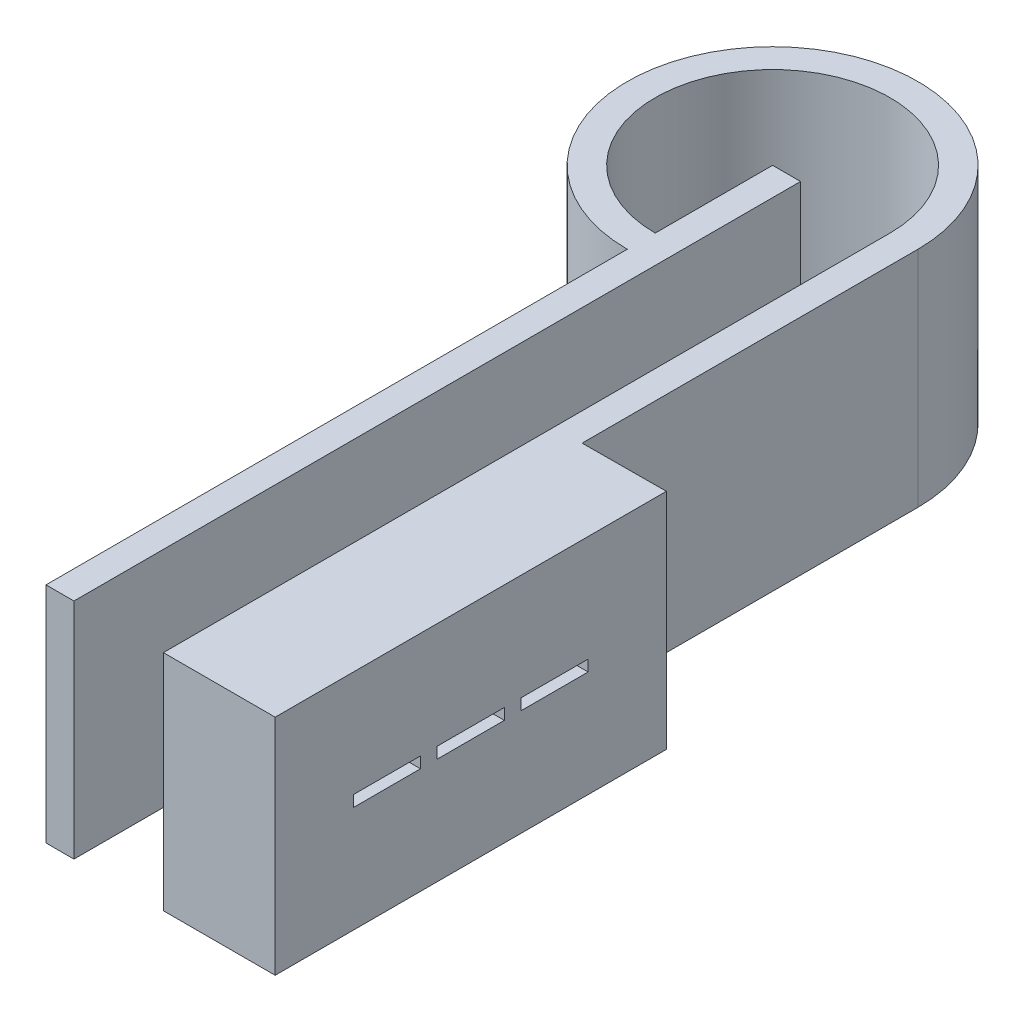
ISO-10303-21;
HEADER;
FILE_DESCRIPTION(('STEP AP214'),'2;1');
FILE_NAME('part.step','',(''),(''),'','','');
FILE_SCHEMA(('AUTOMOTIVE_DESIGN { 1 0 10303 214 1 1 1 1 }'));
ENDSEC;
DATA;
#1=APPLICATION_CONTEXT('core data for automotive mechanical design processes');
#2=APPLICATION_PROTOCOL_DEFINITION('international standard','automotive_design',2000,#1);
#3=PRODUCT_CONTEXT('',#1,'mechanical');
#4=PRODUCT('Part','Part','',(#3));
#5=PRODUCT_RELATED_PRODUCT_CATEGORY('part','',(#4));
#6=PRODUCT_DEFINITION_FORMATION('','',#4);
#7=PRODUCT_DEFINITION_CONTEXT('part definition',#1,'design');
#8=PRODUCT_DEFINITION('design','',#6,#7);
#9=PRODUCT_DEFINITION_SHAPE('','',#8);
#10=(LENGTH_UNIT() NAMED_UNIT(*) SI_UNIT(.MILLI.,.METRE.));
#11=(NAMED_UNIT(*) PLANE_ANGLE_UNIT() SI_UNIT($,.RADIAN.));
#12=(NAMED_UNIT(*) SI_UNIT($,.STERADIAN.) SOLID_ANGLE_UNIT());
#13=UNCERTAINTY_MEASURE_WITH_UNIT(LENGTH_MEASURE(1.E-05),#10,'distance_accuracy_value','');
#14=(GEOMETRIC_REPRESENTATION_CONTEXT(3) GLOBAL_UNCERTAINTY_ASSIGNED_CONTEXT((#13)) GLOBAL_UNIT_ASSIGNED_CONTEXT((#10,
#11,#12)) REPRESENTATION_CONTEXT('',''));
#15=CARTESIAN_POINT('',(0.,0.,0.));
#16=DIRECTION('',(0.,0.,1.));
#17=DIRECTION('',(1.,0.,0.));
#18=AXIS2_PLACEMENT_3D('',#15,#16,#17);
#19=CARTESIAN_POINT('',(-33.301242738674,20.,0.));
#20=DIRECTION('',(1.,0.,0.));
#21=DIRECTION('',(0.,0.,-1.));
#22=AXIS2_PLACEMENT_3D('',#19,#20,#21);
#23=PLANE('',#22);
#24=DIRECTION('',(0.,0.,1.));
#25=VECTOR('',#24,1.);
#26=CARTESIAN_POINT('',(-33.301242738674,0.,0.));
#27=LINE('',#26,#25);
#28=CARTESIAN_POINT('',(-33.301242738674,0.,-22.7488967204412));
#29=VERTEX_POINT('',#28);
#30=CARTESIAN_POINT('',(-33.301242738674,0.,42.2511032795588));
#31=VERTEX_POINT('',#30);
#32=EDGE_CURVE('E293',#29,#31,#27,.T.);
#33=ORIENTED_EDGE('',*,*,#32,.T.);
#34=DIRECTION('',(0.,-1.,0.));
#35=VECTOR('',#34,1.);
#36=CARTESIAN_POINT('',(-33.301242738674,0.,42.2511032795588));
#37=LINE('',#36,#35);
#38=CARTESIAN_POINT('',(-33.301242738674,20.,42.2511032795588));
#39=VERTEX_POINT('',#38);
#40=EDGE_CURVE('E286',#39,#31,#37,.T.);
#41=ORIENTED_EDGE('',*,*,#40,.F.);
#42=DIRECTION('',(0.,0.,1.));
#43=VECTOR('',#42,1.);
#44=CARTESIAN_POINT('',(-33.301242738674,20.,0.));
#45=LINE('',#44,#43);
#46=CARTESIAN_POINT('',(-33.301242738674,20.,-22.7488967204412));
#47=VERTEX_POINT('',#46);
#48=EDGE_CURVE('E268',#47,#39,#45,.T.);
#49=ORIENTED_EDGE('',*,*,#48,.F.);
#50=DIRECTION('',(0.,-1.,0.));
#51=VECTOR('',#50,1.);
#52=CARTESIAN_POINT('',(-33.301242738674,20.,-22.7488967204412));
#53=LINE('',#52,#51);
#54=EDGE_CURVE('E509',#47,#29,#53,.T.);
#55=ORIENTED_EDGE('',*,*,#54,.T.);
#56=EDGE_LOOP('',(#33,#41,#49,#55));
#57=FACE_BOUND('',#56,.T.);
#58=CARTESIAN_POINT('',(-33.301242738674,10.,32.2511032795588));
#59=DIRECTION('',(-1.,0.,0.));
#60=DIRECTION('',(0.,0.,1.));
#61=AXIS2_PLACEMENT_3D('',#58,#59,#60);
#62=CIRCLE('',#61,4.);
#63=CARTESIAN_POINT('',(-33.301242738674,10.,36.2511032795588));
#64=VERTEX_POINT('',#63);
#65=EDGE_CURVE('E449',#64,#64,#62,.T.);
#66=ORIENTED_EDGE('',*,*,#65,.F.);
#67=EDGE_LOOP('',(#66));
#68=FACE_BOUND('',#67,.T.);
#69=CARTESIAN_POINT('',(-33.301242738674,10.,17.2511032795588));
#70=DIRECTION('',(-1.,0.,0.));
#71=DIRECTION('',(0.,0.,1.));
#72=AXIS2_PLACEMENT_3D('',#69,#70,#71);
#73=CIRCLE('',#72,4.);
#74=CARTESIAN_POINT('',(-33.301242738674,10.,21.2511032795588));
#75=VERTEX_POINT('',#74);
#76=EDGE_CURVE('E445',#75,#75,#73,.T.);
#77=ORIENTED_EDGE('',*,*,#76,.F.);
#78=EDGE_LOOP('',(#77));
#79=FACE_BOUND('',#78,.T.);
#80=DIRECTION('',(0.,0.,1.));
#81=VECTOR('',#80,1.);
#82=CARTESIAN_POINT('',(-33.301242738674,10.5,0.));
#83=LINE('',#82,#81);
#84=CARTESIAN_POINT('',(-33.301242738674,10.5,21.7511032795588));
#85=VERTEX_POINT('',#84);
#86=CARTESIAN_POINT('',(-33.301242738674,10.5,22.1996331151242));
#87=VERTEX_POINT('',#86);
#88=EDGE_CURVE('E398',#85,#87,#83,.T.);
#89=ORIENTED_EDGE('',*,*,#88,.T.);
#90=CARTESIAN_POINT('',(-33.301242738674,10.,24.7511032795588));
#91=DIRECTION('',(-1.,0.,0.));
#92=DIRECTION('',(0.,0.,1.));
#93=AXIS2_PLACEMENT_3D('',#90,#91,#92);
#94=CIRCLE('',#93,2.59999999999999);
#95=CARTESIAN_POINT('',(-33.301242738674,10.5,27.3025734439934));
#96=VERTEX_POINT('',#95);
#97=EDGE_CURVE('E322',#96,#87,#94,.T.);
#98=ORIENTED_EDGE('',*,*,#97,.F.);
#99=CARTESIAN_POINT('',(-33.301242738674,10.5,27.7511032795588));
#100=VERTEX_POINT('',#99);
#101=EDGE_CURVE('E396',#96,#100,#83,.T.);
#102=ORIENTED_EDGE('',*,*,#101,.T.);
#103=DIRECTION('',(0.,-1.,0.));
#104=VECTOR('',#103,1.);
#105=CARTESIAN_POINT('',(-33.301242738674,0.,27.7511032795588));
#106=LINE('',#105,#104);
#107=CARTESIAN_POINT('',(-33.301242738674,9.5,27.7511032795588));
#108=VERTEX_POINT('',#107);
#109=EDGE_CURVE('E402',#100,#108,#106,.T.);
#110=ORIENTED_EDGE('',*,*,#109,.T.);
#111=DIRECTION('',(0.,0.,1.));
#112=VECTOR('',#111,1.);
#113=CARTESIAN_POINT('',(-33.301242738674,9.5,0.));
#114=LINE('',#113,#112);
#115=CARTESIAN_POINT('',(-33.301242738674,9.5,27.3025734439934));
#116=VERTEX_POINT('',#115);
#117=EDGE_CURVE('E406',#116,#108,#114,.T.);
#118=ORIENTED_EDGE('',*,*,#117,.F.);
#119=CARTESIAN_POINT('',(-33.301242738674,9.5,22.1996331151242));
#120=VERTEX_POINT('',#119);
#121=EDGE_CURVE('E318',#120,#116,#94,.T.);
#122=ORIENTED_EDGE('',*,*,#121,.F.);
#123=CARTESIAN_POINT('',(-33.301242738674,9.5,21.7511032795588));
#124=VERTEX_POINT('',#123);
#125=EDGE_CURVE('E407',#124,#120,#114,.T.);
#126=ORIENTED_EDGE('',*,*,#125,.F.);
#127=DIRECTION('',(0.,-1.,0.));
#128=VECTOR('',#127,1.);
#129=CARTESIAN_POINT('',(-33.301242738674,0.,21.7511032795588));
#130=LINE('',#129,#128);
#131=EDGE_CURVE('E393',#85,#124,#130,.T.);
#132=ORIENTED_EDGE('',*,*,#131,.F.);
#133=EDGE_LOOP('',(#89,#98,#102,#110,#118,#122,#126,#132));
#134=FACE_BOUND('',#133,.T.);
#135=ADVANCED_FACE('F81',(#57,#68,#79,#134),#23,.F.);
#136=CARTESIAN_POINT('',(-23.301242738674,20.,0.));
#137=DIRECTION('',(1.,0.,0.));
#138=DIRECTION('',(0.,0.,-1.));
#139=AXIS2_PLACEMENT_3D('',#136,#137,#138);
#140=PLANE('',#139);
#141=DIRECTION('',(0.,0.,1.));
#142=VECTOR('',#141,1.);
#143=CARTESIAN_POINT('',(-23.301242738674,0.,0.));
#144=LINE('',#143,#142);
#145=CARTESIAN_POINT('',(-23.301242738674,0.,7.25110327955879));
#146=VERTEX_POINT('',#145);
#147=CARTESIAN_POINT('',(-23.301242738674,0.,42.2511032795588));
#148=VERTEX_POINT('',#147);
#149=EDGE_CURVE('E481',#146,#148,#144,.T.);
#150=ORIENTED_EDGE('',*,*,#149,.F.);
#151=DIRECTION('',(0.,-1.,0.));
#152=VECTOR('',#151,1.);
#153=CARTESIAN_POINT('',(-23.301242738674,20.,7.25110327955879));
#154=LINE('',#153,#152);
#155=CARTESIAN_POINT('',(-23.301242738674,20.,7.25110327955879));
#156=VERTEX_POINT('',#155);
#157=EDGE_CURVE('E506',#156,#146,#154,.T.);
#158=ORIENTED_EDGE('',*,*,#157,.F.);
#159=DIRECTION('',(0.,0.,1.));
#160=VECTOR('',#159,1.);
#161=CARTESIAN_POINT('',(-23.301242738674,20.,0.));
#162=LINE('',#161,#160);
#163=CARTESIAN_POINT('',(-23.301242738674,20.,42.2511032795588));
#164=VERTEX_POINT('',#163);
#165=EDGE_CURVE('E279',#156,#164,#162,.T.);
#166=ORIENTED_EDGE('',*,*,#165,.T.);
#167=DIRECTION('',(0.,1.,0.));
#168=VECTOR('',#167,1.);
#169=CARTESIAN_POINT('',(-23.301242738674,0.,42.2511032795588));
#170=LINE('',#169,#168);
#171=EDGE_CURVE('E288',#148,#164,#170,.T.);
#172=ORIENTED_EDGE('',*,*,#171,.F.);
#173=EDGE_LOOP('',(#150,#158,#166,#172));
#174=FACE_BOUND('',#173,.T.);
#175=DIRECTION('',(0.,0.,1.));
#176=VECTOR('',#175,1.);
#177=CARTESIAN_POINT('',(-23.301242738674,10.5,0.));
#178=LINE('',#177,#176);
#179=CARTESIAN_POINT('',(-23.301242738674,10.5,21.7511032795588));
#180=VERTEX_POINT('',#179);
#181=CARTESIAN_POINT('',(-23.301242738674,10.5,27.7511032795588));
#182=VERTEX_POINT('',#181);
#183=EDGE_CURVE('E415',#180,#182,#178,.T.);
#184=ORIENTED_EDGE('',*,*,#183,.F.);
#185=DIRECTION('',(0.,-1.,0.));
#186=VECTOR('',#185,1.);
#187=CARTESIAN_POINT('',(-23.301242738674,0.,21.7511032795588));
#188=LINE('',#187,#186);
#189=CARTESIAN_POINT('',(-23.301242738674,9.5,21.7511032795588));
#190=VERTEX_POINT('',#189);
#191=EDGE_CURVE('E356',#180,#190,#188,.T.);
#192=ORIENTED_EDGE('',*,*,#191,.T.);
#193=DIRECTION('',(0.,0.,1.));
#194=VECTOR('',#193,1.);
#195=CARTESIAN_POINT('',(-23.301242738674,9.5,0.));
#196=LINE('',#195,#194);
#197=CARTESIAN_POINT('',(-23.301242738674,9.5,27.7511032795588));
#198=VERTEX_POINT('',#197);
#199=EDGE_CURVE('E397',#190,#198,#196,.T.);
#200=ORIENTED_EDGE('',*,*,#199,.T.);
#201=DIRECTION('',(0.,-1.,0.));
#202=VECTOR('',#201,1.);
#203=CARTESIAN_POINT('',(-23.301242738674,0.,27.7511032795588));
#204=LINE('',#203,#202);
#205=EDGE_CURVE('E419',#182,#198,#204,.T.);
#206=ORIENTED_EDGE('',*,*,#205,.F.);
#207=EDGE_LOOP('',(#184,#192,#200,#206));
#208=FACE_BOUND('',#207,.T.);
#209=DIRECTION('',(0.,-1.,0.));
#210=VECTOR('',#209,1.);
#211=CARTESIAN_POINT('',(-23.301242738674,0.,14.2511032795588));
#212=LINE('',#211,#210);
#213=CARTESIAN_POINT('',(-23.301242738674,10.5,14.2511032795588));
#214=VERTEX_POINT('',#213);
#215=CARTESIAN_POINT('',(-23.301242738674,9.49999999999999,14.2511032795588));
#216=VERTEX_POINT('',#215);
#217=EDGE_CURVE('E339',#214,#216,#212,.T.);
#218=ORIENTED_EDGE('',*,*,#217,.T.);
#219=DIRECTION('',(0.,0.,1.));
#220=VECTOR('',#219,1.);
#221=CARTESIAN_POINT('',(-23.301242738674,9.5,0.));
#222=LINE('',#221,#220);
#223=CARTESIAN_POINT('',(-23.301242738674,9.5,20.2511032795588));
#224=VERTEX_POINT('',#223);
#225=EDGE_CURVE('E335',#216,#224,#222,.T.);
#226=ORIENTED_EDGE('',*,*,#225,.T.);
#227=DIRECTION('',(0.,-1.,0.));
#228=VECTOR('',#227,1.);
#229=CARTESIAN_POINT('',(-23.301242738674,0.,20.2511032795588));
#230=LINE('',#229,#228);
#231=CARTESIAN_POINT('',(-23.301242738674,10.5,20.2511032795588));
#232=VERTEX_POINT('',#231);
#233=EDGE_CURVE('E348',#232,#224,#230,.T.);
#234=ORIENTED_EDGE('',*,*,#233,.F.);
#235=DIRECTION('',(0.,0.,1.));
#236=VECTOR('',#235,1.);
#237=CARTESIAN_POINT('',(-23.301242738674,10.5,0.));
#238=LINE('',#237,#236);
#239=EDGE_CURVE('E344',#214,#232,#238,.T.);
#240=ORIENTED_EDGE('',*,*,#239,.F.);
#241=EDGE_LOOP('',(#218,#226,#234,#240));
#242=FACE_BOUND('',#241,.T.);
#243=DIRECTION('',(0.,0.,1.));
#244=VECTOR('',#243,1.);
#245=CARTESIAN_POINT('',(-23.301242738674,10.5,0.));
#246=LINE('',#245,#244);
#247=CARTESIAN_POINT('',(-23.301242738674,10.5,29.2511032795588));
#248=VERTEX_POINT('',#247);
#249=CARTESIAN_POINT('',(-23.301242738674,10.5,35.2511032795588));
#250=VERTEX_POINT('',#249);
#251=EDGE_CURVE('E369',#248,#250,#246,.T.);
#252=ORIENTED_EDGE('',*,*,#251,.F.);
#253=DIRECTION('',(0.,-1.,0.));
#254=VECTOR('',#253,1.);
#255=CARTESIAN_POINT('',(-23.301242738674,0.,29.2511032795588));
#256=LINE('',#255,#254);
#257=CARTESIAN_POINT('',(-23.301242738674,9.5,29.2511032795588));
#258=VERTEX_POINT('',#257);
#259=EDGE_CURVE('E334',#248,#258,#256,.T.);
#260=ORIENTED_EDGE('',*,*,#259,.T.);
#261=DIRECTION('',(0.,0.,1.));
#262=VECTOR('',#261,1.);
#263=CARTESIAN_POINT('',(-23.301242738674,9.50000000000001,0.));
#264=LINE('',#263,#262);
#265=CARTESIAN_POINT('',(-23.301242738674,9.5,35.2511032795588));
#266=VERTEX_POINT('',#265);
#267=EDGE_CURVE('E377',#258,#266,#264,.T.);
#268=ORIENTED_EDGE('',*,*,#267,.T.);
#269=DIRECTION('',(0.,-1.,0.));
#270=VECTOR('',#269,1.);
#271=CARTESIAN_POINT('',(-23.301242738674,0.,35.2511032795588));
#272=LINE('',#271,#270);
#273=EDGE_CURVE('E373',#250,#266,#272,.T.);
#274=ORIENTED_EDGE('',*,*,#273,.F.);
#275=EDGE_LOOP('',(#252,#260,#268,#274));
#276=FACE_BOUND('',#275,.T.);
#277=ADVANCED_FACE('F590',(#174,#208,#242,#276),#140,.T.);
#278=CARTESIAN_POINT('',(-25.301242738674,10.,32.2511032795588));
#279=DIRECTION('',(-1.,0.,0.));
#280=DIRECTION('',(0.,0.,1.));
#281=AXIS2_PLACEMENT_3D('',#278,#279,#280);
#282=PLANE('',#281);
#283=CARTESIAN_POINT('',(-25.301242738674,10.,32.2511032795588));
#284=DIRECTION('',(-1.,0.,0.));
#285=DIRECTION('',(0.,0.,1.));
#286=AXIS2_PLACEMENT_3D('',#283,#284,#285);
#287=CIRCLE('',#286,4.);
#288=CARTESIAN_POINT('',(-25.301242738674,10.,36.2511032795588));
#289=VERTEX_POINT('',#288);
#290=EDGE_CURVE('E430',#289,#289,#287,.T.);
#291=ORIENTED_EDGE('',*,*,#290,.T.);
#292=EDGE_LOOP('',(#291));
#293=FACE_BOUND('',#292,.T.);
#294=DIRECTION('',(0.,0.,-1.));
#295=VECTOR('',#294,1.);
#296=CARTESIAN_POINT('',(-25.301242738674,9.5,32.2511032795588));
#297=LINE('',#296,#295);
#298=CARTESIAN_POINT('',(-25.301242738674,9.5,35.2511032795588));
#299=VERTEX_POINT('',#298);
#300=CARTESIAN_POINT('',(-25.301242738674,9.5,29.2511032795588));
#301=VERTEX_POINT('',#300);
#302=EDGE_CURVE('E561',#299,#301,#297,.T.);
#303=ORIENTED_EDGE('',*,*,#302,.T.);
#304=DIRECTION('',(0.,1.,0.));
#305=VECTOR('',#304,1.);
#306=CARTESIAN_POINT('',(-25.301242738674,10.,29.2511032795588));
#307=LINE('',#306,#305);
#308=CARTESIAN_POINT('',(-25.301242738674,10.5,29.2511032795588));
#309=VERTEX_POINT('',#308);
#310=EDGE_CURVE('E565',#301,#309,#307,.T.);
#311=ORIENTED_EDGE('',*,*,#310,.T.);
#312=DIRECTION('',(0.,0.,-1.));
#313=VECTOR('',#312,1.);
#314=CARTESIAN_POINT('',(-25.301242738674,10.5,32.2511032795588));
#315=LINE('',#314,#313);
#316=CARTESIAN_POINT('',(-25.301242738674,10.5,35.2511032795588));
#317=VERTEX_POINT('',#316);
#318=EDGE_CURVE('E554',#317,#309,#315,.T.);
#319=ORIENTED_EDGE('',*,*,#318,.F.);
#320=DIRECTION('',(0.,1.,0.));
#321=VECTOR('',#320,1.);
#322=CARTESIAN_POINT('',(-25.301242738674,10.,35.2511032795588));
#323=LINE('',#322,#321);
#324=EDGE_CURVE('E557',#299,#317,#323,.T.);
#325=ORIENTED_EDGE('',*,*,#324,.F.);
#326=EDGE_LOOP('',(#303,#311,#319,#325));
#327=FACE_BOUND('',#326,.T.);
#328=ADVANCED_FACE('F625',(#293,#327),#282,.T.);
#329=CARTESIAN_POINT('',(-25.301242738674,0.,0.));
#330=DIRECTION('',(-1.,0.,0.));
#331=DIRECTION('',(0.,0.,1.));
#332=AXIS2_PLACEMENT_3D('',#329,#330,#331);
#333=PLANE('',#332);
#334=CARTESIAN_POINT('',(-25.301242738674,10.,17.2511032795588));
#335=DIRECTION('',(-1.,0.,0.));
#336=DIRECTION('',(0.,0.,1.));
#337=AXIS2_PLACEMENT_3D('',#334,#335,#336);
#338=CIRCLE('',#337,4.);
#339=CARTESIAN_POINT('',(-25.301242738674,10.,21.2511032795588));
#340=VERTEX_POINT('',#339);
#341=EDGE_CURVE('E440',#340,#340,#338,.T.);
#342=ORIENTED_EDGE('',*,*,#341,.T.);
#343=EDGE_LOOP('',(#342));
#344=FACE_BOUND('',#343,.T.);
#345=DIRECTION('',(0.,1.,0.));
#346=VECTOR('',#345,1.);
#347=CARTESIAN_POINT('',(-25.301242738674,0.,20.2511032795588));
#348=LINE('',#347,#346);
#349=CARTESIAN_POINT('',(-25.301242738674,9.5,20.2511032795588));
#350=VERTEX_POINT('',#349);
#351=CARTESIAN_POINT('',(-25.301242738674,10.5,20.2511032795588));
#352=VERTEX_POINT('',#351);
#353=EDGE_CURVE('E547',#350,#352,#348,.T.);
#354=ORIENTED_EDGE('',*,*,#353,.F.);
#355=DIRECTION('',(0.,0.,-1.));
#356=VECTOR('',#355,1.);
#357=CARTESIAN_POINT('',(-25.301242738674,9.5,0.));
#358=LINE('',#357,#356);
#359=CARTESIAN_POINT('',(-25.301242738674,9.49999999999999,14.2511032795588));
#360=VERTEX_POINT('',#359);
#361=EDGE_CURVE('E550',#350,#360,#358,.T.);
#362=ORIENTED_EDGE('',*,*,#361,.T.);
#363=DIRECTION('',(0.,1.,0.));
#364=VECTOR('',#363,1.);
#365=CARTESIAN_POINT('',(-25.301242738674,0.,14.2511032795588));
#366=LINE('',#365,#364);
#367=CARTESIAN_POINT('',(-25.301242738674,10.5,14.2511032795588));
#368=VERTEX_POINT('',#367);
#369=EDGE_CURVE('E512',#360,#368,#366,.T.);
#370=ORIENTED_EDGE('',*,*,#369,.T.);
#371=DIRECTION('',(0.,0.,-1.));
#372=VECTOR('',#371,1.);
#373=CARTESIAN_POINT('',(-25.301242738674,10.5,0.));
#374=LINE('',#373,#372);
#375=EDGE_CURVE('E543',#352,#368,#374,.T.);
#376=ORIENTED_EDGE('',*,*,#375,.F.);
#377=EDGE_LOOP('',(#354,#362,#370,#376));
#378=FACE_BOUND('',#377,.T.);
#379=ADVANCED_FACE('F667',(#344,#378),#333,.T.);
#380=CARTESIAN_POINT('',(0.0399028769199251,20.,7.1202971000437));
#381=DIRECTION('',(-0.00560401480160105,0.,-0.999984297385766));
#382=DIRECTION('',(-0.999984297385766,0.,0.00560401480160105));
#383=AXIS2_PLACEMENT_3D('',#380,#381,#382);
#384=PLANE('',#383);
#385=DIRECTION('',(0.999984297385766,0.,-0.00560401480160105));
#386=VECTOR('',#385,1.);
#387=CARTESIAN_POINT('',(0.0399028769199251,0.,7.1202971000437));
#388=LINE('',#387,#386);
#389=CARTESIAN_POINT('',(-30.801242738674,0.,7.29313405056379));
#390=VERTEX_POINT('',#389);
#391=EDGE_CURVE('E484',#390,#146,#388,.T.);
#392=ORIENTED_EDGE('',*,*,#391,.F.);
#393=DIRECTION('',(0.,-1.,0.));
#394=VECTOR('',#393,1.);
#395=CARTESIAN_POINT('',(-30.801242738674,20.,7.29313405056379));
#396=LINE('',#395,#394);
#397=CARTESIAN_POINT('',(-30.801242738674,20.,7.29313405056379));
#398=VERTEX_POINT('',#397);
#399=EDGE_CURVE('E503',#398,#390,#396,.T.);
#400=ORIENTED_EDGE('',*,*,#399,.F.);
#401=DIRECTION('',(0.999984297385766,0.,-0.00560401480160105));
#402=VECTOR('',#401,1.);
#403=CARTESIAN_POINT('',(0.0399028769199251,20.,7.1202971000437));
#404=LINE('',#403,#402);
#405=EDGE_CURVE('E461',#398,#156,#404,.T.);
#406=ORIENTED_EDGE('',*,*,#405,.T.);
#407=ORIENTED_EDGE('',*,*,#157,.T.);
#408=EDGE_LOOP('',(#392,#400,#406,#407));
#409=FACE_BOUND('',#408,.T.);
#410=ADVANCED_FACE('F679',(#409),#384,.T.);
#411=CARTESIAN_POINT('',(-30.801242738674,20.,0.));
#412=DIRECTION('',(1.,0.,0.));
#413=DIRECTION('',(0.,0.,-1.));
#414=AXIS2_PLACEMENT_3D('',#411,#412,#413);
#415=PLANE('',#414);
#416=DIRECTION('',(0.,0.,1.));
#417=VECTOR('',#416,1.);
#418=CARTESIAN_POINT('',(-30.801242738674,0.,0.));
#419=LINE('',#418,#417);
#420=CARTESIAN_POINT('',(-30.801242738674,0.,-22.7488967204412));
#421=VERTEX_POINT('',#420);
#422=EDGE_CURVE('E488',#421,#390,#419,.T.);
#423=ORIENTED_EDGE('',*,*,#422,.F.);
#424=DIRECTION('',(0.,-1.,0.));
#425=VECTOR('',#424,1.);
#426=CARTESIAN_POINT('',(-30.801242738674,20.,-22.7488967204412));
#427=LINE('',#426,#425);
#428=CARTESIAN_POINT('',(-30.801242738674,20.,-22.7488967204412));
#429=VERTEX_POINT('',#428);
#430=EDGE_CURVE('E500',#429,#421,#427,.T.);
#431=ORIENTED_EDGE('',*,*,#430,.F.);
#432=DIRECTION('',(0.,0.,1.));
#433=VECTOR('',#432,1.);
#434=CARTESIAN_POINT('',(-30.801242738674,20.,0.));
#435=LINE('',#434,#433);
#436=EDGE_CURVE('E465',#429,#398,#435,.T.);
#437=ORIENTED_EDGE('',*,*,#436,.T.);
#438=ORIENTED_EDGE('',*,*,#399,.T.);
#439=EDGE_LOOP('',(#423,#431,#437,#438));
#440=FACE_BOUND('',#439,.T.);
#441=ADVANCED_FACE('F676',(#440),#415,.T.);
#442=CARTESIAN_POINT('',(-43.801242738674,20.,-22.7488967204412));
#443=DIRECTION('',(0.,-1.,0.));
#444=DIRECTION('',(0.,0.,-1.));
#445=AXIS2_PLACEMENT_3D('',#442,#443,#444);
#446=CYLINDRICAL_SURFACE('',#445,13.);
#447=CARTESIAN_POINT('',(-43.801242738674,0.,-22.7488967204412));
#448=DIRECTION('',(0.,1.,0.));
#449=DIRECTION('',(0.,0.,1.));
#450=AXIS2_PLACEMENT_3D('',#447,#448,#449);
#451=CIRCLE('',#450,13.);
#452=CARTESIAN_POINT('',(-43.801242738674,0.,-9.74889672044119));
#453=VERTEX_POINT('',#452);
#454=EDGE_CURVE('E457',#421,#453,#451,.T.);
#455=ORIENTED_EDGE('',*,*,#454,.T.);
#456=DIRECTION('',(0.,-1.,0.));
#457=VECTOR('',#456,1.);
#458=CARTESIAN_POINT('',(-43.801242738674,20.,-9.74889672044119));
#459=LINE('',#458,#457);
#460=CARTESIAN_POINT('',(-43.801242738674,20.,-9.74889672044119));
#461=VERTEX_POINT('',#460);
#462=EDGE_CURVE('E497',#461,#453,#459,.T.);
#463=ORIENTED_EDGE('',*,*,#462,.F.);
#464=CARTESIAN_POINT('',(-43.801242738674,20.,-22.7488967204412));
#465=DIRECTION('',(0.,1.,0.));
#466=DIRECTION('',(0.,0.,1.));
#467=AXIS2_PLACEMENT_3D('',#464,#465,#466);
#468=CIRCLE('',#467,13.);
#469=EDGE_CURVE('E469',#429,#461,#468,.T.);
#470=ORIENTED_EDGE('',*,*,#469,.F.);
#471=ORIENTED_EDGE('',*,*,#430,.T.);
#472=EDGE_LOOP('',(#455,#463,#470,#471));
#473=FACE_BOUND('',#472,.T.);
#474=ADVANCED_FACE('F634',(#473),#446,.T.);
#475=CARTESIAN_POINT('',(-43.801242738674,20.,-22.7488967204412));
#476=DIRECTION('',(0.,-1.,0.));
#477=DIRECTION('',(0.,0.,-1.));
#478=AXIS2_PLACEMENT_3D('',#475,#476,#477);
#479=CYLINDRICAL_SURFACE('',#478,10.5);
#480=CARTESIAN_POINT('',(-43.801242738674,0.,-22.7488967204412));
#481=DIRECTION('',(0.,1.,0.));
#482=DIRECTION('',(0.,0.,1.));
#483=AXIS2_PLACEMENT_3D('',#480,#481,#482);
#484=CIRCLE('',#483,10.5);
#485=CARTESIAN_POINT('',(-43.801242738674,0.,-12.2488967204412));
#486=VERTEX_POINT('',#485);
#487=EDGE_CURVE('E474',#29,#486,#484,.T.);
#488=ORIENTED_EDGE('',*,*,#487,.F.);
#489=ORIENTED_EDGE('',*,*,#54,.F.);
#490=CARTESIAN_POINT('',(-43.801242738674,20.,-22.7488967204412));
#491=DIRECTION('',(0.,1.,0.));
#492=DIRECTION('',(0.,0.,1.));
#493=AXIS2_PLACEMENT_3D('',#490,#491,#492);
#494=CIRCLE('',#493,10.5);
#495=CARTESIAN_POINT('',(-43.801242738674,20.,-12.2488967204412));
#496=VERTEX_POINT('',#495);
#497=EDGE_CURVE('E275',#47,#496,#494,.T.);
#498=ORIENTED_EDGE('',*,*,#497,.T.);
#499=DIRECTION('',(0.,-1.,0.));
#500=VECTOR('',#499,1.);
#501=CARTESIAN_POINT('',(-43.801242738674,20.,-12.2488967204412));
#502=LINE('',#501,#500);
#503=EDGE_CURVE('E473',#496,#486,#502,.T.);
#504=ORIENTED_EDGE('',*,*,#503,.T.);
#505=EDGE_LOOP('',(#488,#489,#498,#504));
#506=FACE_BOUND('',#505,.T.);
#507=ADVANCED_FACE('F630',(#506),#479,.F.);
#508=CARTESIAN_POINT('',(0.,0.,0.));
#509=DIRECTION('',(0.,1.,0.));
#510=DIRECTION('',(0.,0.,1.));
#511=AXIS2_PLACEMENT_3D('',#508,#509,#510);
#512=PLANE('',#511);
#513=ORIENTED_EDGE('',*,*,#487,.T.);
#514=DIRECTION('',(0.,0.,1.));
#515=VECTOR('',#514,1.);
#516=CARTESIAN_POINT('',(-43.801242738674,0.,-22.7488967204412));
#517=LINE('',#516,#515);
#518=CARTESIAN_POINT('',(-43.801242738674,0.,-22.7488967204412));
#519=VERTEX_POINT('',#518);
#520=EDGE_CURVE('E518',#519,#486,#517,.T.);
#521=ORIENTED_EDGE('',*,*,#520,.F.);
#522=DIRECTION('',(1.,0.,0.));
#523=VECTOR('',#522,1.);
#524=CARTESIAN_POINT('',(-43.801242738674,0.,-22.7488967204412));
#525=LINE('',#524,#523);
#526=CARTESIAN_POINT('',(-41.301242738674,0.,-22.7488967204412));
#527=VERTEX_POINT('',#526);
#528=EDGE_CURVE('E444',#519,#527,#525,.T.);
#529=ORIENTED_EDGE('',*,*,#528,.T.);
#530=DIRECTION('',(0.,0.,1.));
#531=VECTOR('',#530,1.);
#532=CARTESIAN_POINT('',(-41.301242738674,0.,-22.7488967204412));
#533=LINE('',#532,#531);
#534=CARTESIAN_POINT('',(-41.301242738674,0.,42.2511032795588));
#535=VERTEX_POINT('',#534);
#536=EDGE_CURVE('E529',#527,#535,#533,.T.);
#537=ORIENTED_EDGE('',*,*,#536,.T.);
#538=DIRECTION('',(1.,0.,0.));
#539=VECTOR('',#538,1.);
#540=CARTESIAN_POINT('',(-43.801242738674,0.,42.2511032795588));
#541=LINE('',#540,#539);
#542=CARTESIAN_POINT('',(-43.801242738674,0.,42.2511032795588));
#543=VERTEX_POINT('',#542);
#544=EDGE_CURVE('E302',#543,#535,#541,.T.);
#545=ORIENTED_EDGE('',*,*,#544,.F.);
#546=EDGE_CURVE('E532',#453,#543,#517,.T.);
#547=ORIENTED_EDGE('',*,*,#546,.F.);
#548=ORIENTED_EDGE('',*,*,#454,.F.);
#549=ORIENTED_EDGE('',*,*,#422,.T.);
#550=ORIENTED_EDGE('',*,*,#391,.T.);
#551=ORIENTED_EDGE('',*,*,#149,.T.);
#552=DIRECTION('',(1.,0.,0.));
#553=VECTOR('',#552,1.);
#554=CARTESIAN_POINT('',(-33.301242738674,0.,42.2511032795588));
#555=LINE('',#554,#553);
#556=EDGE_CURVE('E297',#31,#148,#555,.T.);
#557=ORIENTED_EDGE('',*,*,#556,.F.);
#558=ORIENTED_EDGE('',*,*,#32,.F.);
#559=EDGE_LOOP('',(#513,#521,#529,#537,#545,#547,#548,#549,#550,#551,#557,#558));
#560=FACE_BOUND('',#559,.T.);
#561=ADVANCED_FACE('F633',(#560),#512,.F.);
#562=CARTESIAN_POINT('',(0.,20.,0.));
#563=DIRECTION('',(0.,1.,0.));
#564=DIRECTION('',(0.,0.,1.));
#565=AXIS2_PLACEMENT_3D('',#562,#563,#564);
#566=PLANE('',#565);
#567=ORIENTED_EDGE('',*,*,#497,.F.);
#568=ORIENTED_EDGE('',*,*,#48,.T.);
#569=DIRECTION('',(-1.,0.,0.));
#570=VECTOR('',#569,1.);
#571=CARTESIAN_POINT('',(-33.301242738674,20.,42.2511032795588));
#572=LINE('',#571,#570);
#573=EDGE_CURVE('E272',#164,#39,#572,.T.);
#574=ORIENTED_EDGE('',*,*,#573,.F.);
#575=ORIENTED_EDGE('',*,*,#165,.F.);
#576=ORIENTED_EDGE('',*,*,#405,.F.);
#577=ORIENTED_EDGE('',*,*,#436,.F.);
#578=ORIENTED_EDGE('',*,*,#469,.T.);
#579=DIRECTION('',(0.,0.,1.));
#580=VECTOR('',#579,1.);
#581=CARTESIAN_POINT('',(-43.801242738674,20.,-22.7488967204412));
#582=LINE('',#581,#580);
#583=CARTESIAN_POINT('',(-43.801242738674,20.,42.2511032795588));
#584=VERTEX_POINT('',#583);
#585=EDGE_CURVE('E521',#461,#584,#582,.T.);
#586=ORIENTED_EDGE('',*,*,#585,.T.);
#587=DIRECTION('',(-1.,0.,0.));
#588=VECTOR('',#587,1.);
#589=CARTESIAN_POINT('',(-43.801242738674,20.,42.2511032795588));
#590=LINE('',#589,#588);
#591=CARTESIAN_POINT('',(-41.301242738674,20.,42.2511032795588));
#592=VERTEX_POINT('',#591);
#593=EDGE_CURVE('E314',#592,#584,#590,.T.);
#594=ORIENTED_EDGE('',*,*,#593,.F.);
#595=DIRECTION('',(0.,0.,1.));
#596=VECTOR('',#595,1.);
#597=CARTESIAN_POINT('',(-41.301242738674,20.,-22.7488967204412));
#598=LINE('',#597,#596);
#599=CARTESIAN_POINT('',(-41.301242738674,20.,-22.7488967204412));
#600=VERTEX_POINT('',#599);
#601=EDGE_CURVE('E517',#600,#592,#598,.T.);
#602=ORIENTED_EDGE('',*,*,#601,.F.);
#603=DIRECTION('',(1.,0.,0.));
#604=VECTOR('',#603,1.);
#605=CARTESIAN_POINT('',(-43.801242738674,20.,-22.7488967204412));
#606=LINE('',#605,#604);
#607=CARTESIAN_POINT('',(-43.801242738674,20.,-22.7488967204412));
#608=VERTEX_POINT('',#607);
#609=EDGE_CURVE('E513',#608,#600,#606,.T.);
#610=ORIENTED_EDGE('',*,*,#609,.F.);
#611=EDGE_CURVE('E522',#608,#496,#582,.T.);
#612=ORIENTED_EDGE('',*,*,#611,.T.);
#613=EDGE_LOOP('',(#567,#568,#574,#575,#576,#577,#578,#586,#594,#602,#610,#612));
#614=FACE_BOUND('',#613,.T.);
#615=ADVANCED_FACE('F270',(#614),#566,.T.);
#616=CARTESIAN_POINT('',(-43.801242738674,20.,-22.7488967204412));
#617=DIRECTION('',(1.,0.,0.));
#618=DIRECTION('',(0.,0.,-1.));
#619=AXIS2_PLACEMENT_3D('',#616,#617,#618);
#620=PLANE('',#619);
#621=ORIENTED_EDGE('',*,*,#503,.F.);
#622=ORIENTED_EDGE('',*,*,#611,.F.);
#623=DIRECTION('',(0.,-1.,0.));
#624=VECTOR('',#623,1.);
#625=CARTESIAN_POINT('',(-43.801242738674,20.,-22.7488967204412));
#626=LINE('',#625,#624);
#627=EDGE_CURVE('E478',#608,#519,#626,.T.);
#628=ORIENTED_EDGE('',*,*,#627,.T.);
#629=ORIENTED_EDGE('',*,*,#520,.T.);
#630=EDGE_LOOP('',(#621,#622,#628,#629));
#631=FACE_BOUND('',#630,.T.);
#632=ADVANCED_FACE('F636',(#631),#620,.F.);
#633=ORIENTED_EDGE('',*,*,#585,.F.);
#634=ORIENTED_EDGE('',*,*,#462,.T.);
#635=ORIENTED_EDGE('',*,*,#546,.T.);
#636=DIRECTION('',(0.,-1.,0.));
#637=VECTOR('',#636,1.);
#638=CARTESIAN_POINT('',(-43.801242738674,20.,42.2511032795588));
#639=LINE('',#638,#637);
#640=EDGE_CURVE('E296',#584,#543,#639,.T.);
#641=ORIENTED_EDGE('',*,*,#640,.F.);
#642=EDGE_LOOP('',(#633,#634,#635,#641));
#643=FACE_BOUND('',#642,.T.);
#644=ADVANCED_FACE('F638',(#643),#620,.F.);
#645=CARTESIAN_POINT('',(-41.301242738674,20.,-22.7488967204412));
#646=DIRECTION('',(1.,0.,0.));
#647=DIRECTION('',(0.,0.,-1.));
#648=AXIS2_PLACEMENT_3D('',#645,#646,#647);
#649=PLANE('',#648);
#650=ORIENTED_EDGE('',*,*,#536,.F.);
#651=DIRECTION('',(0.,-1.,0.));
#652=VECTOR('',#651,1.);
#653=CARTESIAN_POINT('',(-41.301242738674,20.,-22.7488967204412));
#654=LINE('',#653,#652);
#655=EDGE_CURVE('E525',#600,#527,#654,.T.);
#656=ORIENTED_EDGE('',*,*,#655,.F.);
#657=ORIENTED_EDGE('',*,*,#601,.T.);
#658=DIRECTION('',(0.,1.,0.));
#659=VECTOR('',#658,1.);
#660=CARTESIAN_POINT('',(-41.301242738674,20.,42.2511032795588));
#661=LINE('',#660,#659);
#662=EDGE_CURVE('E310',#535,#592,#661,.T.);
#663=ORIENTED_EDGE('',*,*,#662,.F.);
#664=EDGE_LOOP('',(#650,#656,#657,#663));
#665=FACE_BOUND('',#664,.T.);
#666=ADVANCED_FACE('F640',(#665),#649,.T.);
#667=CARTESIAN_POINT('',(-43.801242738674,20.,-22.7488967204412));
#668=DIRECTION('',(0.,0.,-1.));
#669=DIRECTION('',(-1.,0.,0.));
#670=AXIS2_PLACEMENT_3D('',#667,#668,#669);
#671=PLANE('',#670);
#672=ORIENTED_EDGE('',*,*,#528,.F.);
#673=ORIENTED_EDGE('',*,*,#627,.F.);
#674=ORIENTED_EDGE('',*,*,#609,.T.);
#675=ORIENTED_EDGE('',*,*,#655,.T.);
#676=EDGE_LOOP('',(#672,#673,#674,#675));
#677=FACE_BOUND('',#676,.T.);
#678=ADVANCED_FACE('F83',(#677),#671,.T.);
#679=CARTESIAN_POINT('',(-25.301242738674,10.,32.2511032795588));
#680=DIRECTION('',(-1.,0.,0.));
#681=DIRECTION('',(0.,0.,1.));
#682=AXIS2_PLACEMENT_3D('',#679,#680,#681);
#683=CYLINDRICAL_SURFACE('',#682,4.);
#684=ORIENTED_EDGE('',*,*,#290,.F.);
#685=EDGE_LOOP('',(#684));
#686=FACE_BOUND('',#685,.T.);
#687=ORIENTED_EDGE('',*,*,#65,.T.);
#688=EDGE_LOOP('',(#687));
#689=FACE_BOUND('',#688,.T.);
#690=ADVANCED_FACE('F643',(#686,#689),#683,.F.);
#691=CARTESIAN_POINT('',(-25.301242738674,10.,17.2511032795588));
#692=DIRECTION('',(-1.,0.,0.));
#693=DIRECTION('',(0.,0.,1.));
#694=AXIS2_PLACEMENT_3D('',#691,#692,#693);
#695=CYLINDRICAL_SURFACE('',#694,4.);
#696=ORIENTED_EDGE('',*,*,#341,.F.);
#697=EDGE_LOOP('',(#696));
#698=FACE_BOUND('',#697,.T.);
#699=ORIENTED_EDGE('',*,*,#76,.T.);
#700=EDGE_LOOP('',(#699));
#701=FACE_BOUND('',#700,.T.);
#702=ADVANCED_FACE('F652',(#698,#701),#695,.F.);
#703=CARTESIAN_POINT('',(-33.301242738674,9.5,0.));
#704=DIRECTION('',(0.,1.,0.));
#705=DIRECTION('',(0.,0.,1.));
#706=AXIS2_PLACEMENT_3D('',#703,#704,#705);
#707=PLANE('',#706);
#708=DIRECTION('',(1.,0.,0.));
#709=VECTOR('',#708,1.);
#710=CARTESIAN_POINT('',(-33.301242738674,9.5,20.2511032795588));
#711=LINE('',#710,#709);
#712=EDGE_CURVE('E353',#350,#224,#711,.T.);
#713=ORIENTED_EDGE('',*,*,#712,.T.);
#714=ORIENTED_EDGE('',*,*,#225,.F.);
#715=DIRECTION('',(1.,0.,0.));
#716=VECTOR('',#715,1.);
#717=CARTESIAN_POINT('',(-33.301242738674,9.49999999999999,14.2511032795588));
#718=LINE('',#717,#716);
#719=EDGE_CURVE('E352',#360,#216,#718,.T.);
#720=ORIENTED_EDGE('',*,*,#719,.F.);
#721=ORIENTED_EDGE('',*,*,#361,.F.);
#722=EDGE_LOOP('',(#713,#714,#720,#721));
#723=FACE_BOUND('',#722,.T.);
#724=ADVANCED_FACE('F658',(#723),#707,.T.);
#725=CARTESIAN_POINT('',(-33.301242738674,0.,20.2511032795588));
#726=DIRECTION('',(0.,0.,1.));
#727=DIRECTION('',(1.,0.,0.));
#728=AXIS2_PLACEMENT_3D('',#725,#726,#727);
#729=PLANE('',#728);
#730=ORIENTED_EDGE('',*,*,#353,.T.);
#731=DIRECTION('',(1.,0.,0.));
#732=VECTOR('',#731,1.);
#733=CARTESIAN_POINT('',(-33.301242738674,10.5,20.2511032795588));
#734=LINE('',#733,#732);
#735=EDGE_CURVE('E357',#352,#232,#734,.T.);
#736=ORIENTED_EDGE('',*,*,#735,.T.);
#737=ORIENTED_EDGE('',*,*,#233,.T.);
#738=ORIENTED_EDGE('',*,*,#712,.F.);
#739=EDGE_LOOP('',(#730,#736,#737,#738));
#740=FACE_BOUND('',#739,.T.);
#741=ADVANCED_FACE('F741',(#740),#729,.F.);
#742=CARTESIAN_POINT('',(-33.301242738674,10.5,0.));
#743=DIRECTION('',(0.,1.,0.));
#744=DIRECTION('',(0.,0.,1.));
#745=AXIS2_PLACEMENT_3D('',#742,#743,#744);
#746=PLANE('',#745);
#747=ORIENTED_EDGE('',*,*,#375,.T.);
#748=DIRECTION('',(1.,0.,0.));
#749=VECTOR('',#748,1.);
#750=CARTESIAN_POINT('',(-33.301242738674,10.5,14.2511032795588));
#751=LINE('',#750,#749);
#752=EDGE_CURVE('E360',#368,#214,#751,.T.);
#753=ORIENTED_EDGE('',*,*,#752,.T.);
#754=ORIENTED_EDGE('',*,*,#239,.T.);
#755=ORIENTED_EDGE('',*,*,#735,.F.);
#756=EDGE_LOOP('',(#747,#753,#754,#755));
#757=FACE_BOUND('',#756,.T.);
#758=ADVANCED_FACE('F745',(#757),#746,.F.);
#759=CARTESIAN_POINT('',(-33.301242738674,0.,14.2511032795588));
#760=DIRECTION('',(0.,0.,1.));
#761=DIRECTION('',(1.,0.,0.));
#762=AXIS2_PLACEMENT_3D('',#759,#760,#761);
#763=PLANE('',#762);
#764=ORIENTED_EDGE('',*,*,#719,.T.);
#765=ORIENTED_EDGE('',*,*,#217,.F.);
#766=ORIENTED_EDGE('',*,*,#752,.F.);
#767=ORIENTED_EDGE('',*,*,#369,.F.);
#768=EDGE_LOOP('',(#764,#765,#766,#767));
#769=FACE_BOUND('',#768,.T.);
#770=ADVANCED_FACE('F727',(#769),#763,.T.);
#771=CARTESIAN_POINT('',(-33.301242738674,0.,29.2511032795588));
#772=DIRECTION('',(0.,0.,1.));
#773=DIRECTION('',(1.,0.,0.));
#774=AXIS2_PLACEMENT_3D('',#771,#772,#773);
#775=PLANE('',#774);
#776=DIRECTION('',(1.,0.,0.));
#777=VECTOR('',#776,1.);
#778=CARTESIAN_POINT('',(-33.301242738674,9.5,29.2511032795588));
#779=LINE('',#778,#777);
#780=EDGE_CURVE('E340',#301,#258,#779,.T.);
#781=ORIENTED_EDGE('',*,*,#780,.T.);
#782=ORIENTED_EDGE('',*,*,#259,.F.);
#783=DIRECTION('',(1.,0.,0.));
#784=VECTOR('',#783,1.);
#785=CARTESIAN_POINT('',(-33.301242738674,10.5,29.2511032795588));
#786=LINE('',#785,#784);
#787=EDGE_CURVE('E381',#309,#248,#786,.T.);
#788=ORIENTED_EDGE('',*,*,#787,.F.);
#789=ORIENTED_EDGE('',*,*,#310,.F.);
#790=EDGE_LOOP('',(#781,#782,#788,#789));
#791=FACE_BOUND('',#790,.T.);
#792=ADVANCED_FACE('F723',(#791),#775,.T.);
#793=CARTESIAN_POINT('',(-33.301242738674,9.50000000000001,0.));
#794=DIRECTION('',(0.,1.,0.));
#795=DIRECTION('',(0.,0.,1.));
#796=AXIS2_PLACEMENT_3D('',#793,#794,#795);
#797=PLANE('',#796);
#798=DIRECTION('',(1.,0.,0.));
#799=VECTOR('',#798,1.);
#800=CARTESIAN_POINT('',(-33.301242738674,9.5,35.2511032795588));
#801=LINE('',#800,#799);
#802=EDGE_CURVE('E384',#299,#266,#801,.T.);
#803=ORIENTED_EDGE('',*,*,#802,.T.);
#804=ORIENTED_EDGE('',*,*,#267,.F.);
#805=ORIENTED_EDGE('',*,*,#780,.F.);
#806=ORIENTED_EDGE('',*,*,#302,.F.);
#807=EDGE_LOOP('',(#803,#804,#805,#806));
#808=FACE_BOUND('',#807,.T.);
#809=ADVANCED_FACE('F726',(#808),#797,.T.);
#810=CARTESIAN_POINT('',(-33.301242738674,0.,35.2511032795588));
#811=DIRECTION('',(0.,0.,1.));
#812=DIRECTION('',(1.,0.,0.));
#813=AXIS2_PLACEMENT_3D('',#810,#811,#812);
#814=PLANE('',#813);
#815=ORIENTED_EDGE('',*,*,#324,.T.);
#816=DIRECTION('',(1.,0.,0.));
#817=VECTOR('',#816,1.);
#818=CARTESIAN_POINT('',(-33.301242738674,10.5,35.2511032795588));
#819=LINE('',#818,#817);
#820=EDGE_CURVE('E387',#317,#250,#819,.T.);
#821=ORIENTED_EDGE('',*,*,#820,.T.);
#822=ORIENTED_EDGE('',*,*,#273,.T.);
#823=ORIENTED_EDGE('',*,*,#802,.F.);
#824=EDGE_LOOP('',(#815,#821,#822,#823));
#825=FACE_BOUND('',#824,.T.);
#826=ADVANCED_FACE('F731',(#825),#814,.F.);
#827=CARTESIAN_POINT('',(-33.301242738674,10.5,0.));
#828=DIRECTION('',(0.,1.,0.));
#829=DIRECTION('',(0.,0.,1.));
#830=AXIS2_PLACEMENT_3D('',#827,#828,#829);
#831=PLANE('',#830);
#832=ORIENTED_EDGE('',*,*,#318,.T.);
#833=ORIENTED_EDGE('',*,*,#787,.T.);
#834=ORIENTED_EDGE('',*,*,#251,.T.);
#835=ORIENTED_EDGE('',*,*,#820,.F.);
#836=EDGE_LOOP('',(#832,#833,#834,#835));
#837=FACE_BOUND('',#836,.T.);
#838=ADVANCED_FACE('F716',(#837),#831,.F.);
#839=CARTESIAN_POINT('',(-33.301242738674,0.,21.7511032795588));
#840=DIRECTION('',(0.,0.,1.));
#841=DIRECTION('',(0.,-1.,0.));
#842=AXIS2_PLACEMENT_3D('',#839,#840,#841);
#843=PLANE('',#842);
#844=ORIENTED_EDGE('',*,*,#191,.F.);
#845=DIRECTION('',(1.,0.,0.));
#846=VECTOR('',#845,1.);
#847=CARTESIAN_POINT('',(-33.301242738674,10.5,21.7511032795588));
#848=LINE('',#847,#846);
#849=EDGE_CURVE('E411',#85,#180,#848,.T.);
#850=ORIENTED_EDGE('',*,*,#849,.F.);
#851=ORIENTED_EDGE('',*,*,#131,.T.);
#852=DIRECTION('',(1.,0.,0.));
#853=VECTOR('',#852,1.);
#854=CARTESIAN_POINT('',(-33.301242738674,9.5,21.7511032795588));
#855=LINE('',#854,#853);
#856=EDGE_CURVE('E426',#124,#190,#855,.T.);
#857=ORIENTED_EDGE('',*,*,#856,.T.);
#858=EDGE_LOOP('',(#844,#850,#851,#857));
#859=FACE_BOUND('',#858,.T.);
#860=ADVANCED_FACE('F713',(#859),#843,.T.);
#861=CARTESIAN_POINT('',(-33.301242738674,9.5,0.));
#862=DIRECTION('',(0.,1.,0.));
#863=DIRECTION('',(0.,0.,1.));
#864=AXIS2_PLACEMENT_3D('',#861,#862,#863);
#865=PLANE('',#864);
#866=DIRECTION('',(-1.,0.,0.));
#867=VECTOR('',#866,1.);
#868=CARTESIAN_POINT('',(-31.801242738674,9.5,22.1996331151242));
#869=LINE('',#868,#867);
#870=CARTESIAN_POINT('',(-31.801242738674,9.5,22.1996331151242));
#871=VERTEX_POINT('',#870);
#872=EDGE_CURVE('E331',#871,#120,#869,.T.);
#873=ORIENTED_EDGE('',*,*,#872,.F.);
#874=DIRECTION('',(0.,0.,1.));
#875=VECTOR('',#874,1.);
#876=CARTESIAN_POINT('',(-31.801242738674,9.5,0.));
#877=LINE('',#876,#875);
#878=CARTESIAN_POINT('',(-31.801242738674,9.5,27.3025734439934));
#879=VERTEX_POINT('',#878);
#880=EDGE_CURVE('E321',#871,#879,#877,.T.);
#881=ORIENTED_EDGE('',*,*,#880,.T.);
#882=DIRECTION('',(-1.,0.,0.));
#883=VECTOR('',#882,1.);
#884=CARTESIAN_POINT('',(-31.801242738674,9.5,27.3025734439934));
#885=LINE('',#884,#883);
#886=EDGE_CURVE('E328',#116,#879,#885,.F.);
#887=ORIENTED_EDGE('',*,*,#886,.F.);
#888=ORIENTED_EDGE('',*,*,#117,.T.);
#889=DIRECTION('',(1.,0.,0.));
#890=VECTOR('',#889,1.);
#891=CARTESIAN_POINT('',(-33.301242738674,9.5,27.7511032795588));
#892=LINE('',#891,#890);
#893=EDGE_CURVE('E431',#108,#198,#892,.T.);
#894=ORIENTED_EDGE('',*,*,#893,.T.);
#895=ORIENTED_EDGE('',*,*,#199,.F.);
#896=ORIENTED_EDGE('',*,*,#856,.F.);
#897=ORIENTED_EDGE('',*,*,#125,.T.);
#898=EDGE_LOOP('',(#873,#881,#887,#888,#894,#895,#896,#897));
#899=FACE_BOUND('',#898,.T.);
#900=ADVANCED_FACE('F606',(#899),#865,.T.);
#901=CARTESIAN_POINT('',(-33.301242738674,0.,27.7511032795588));
#902=DIRECTION('',(0.,0.,1.));
#903=DIRECTION('',(1.,0.,0.));
#904=AXIS2_PLACEMENT_3D('',#901,#902,#903);
#905=PLANE('',#904);
#906=ORIENTED_EDGE('',*,*,#205,.T.);
#907=ORIENTED_EDGE('',*,*,#893,.F.);
#908=ORIENTED_EDGE('',*,*,#109,.F.);
#909=DIRECTION('',(1.,0.,0.));
#910=VECTOR('',#909,1.);
#911=CARTESIAN_POINT('',(-33.301242738674,10.5,27.7511032795588));
#912=LINE('',#911,#910);
#913=EDGE_CURVE('E434',#100,#182,#912,.T.);
#914=ORIENTED_EDGE('',*,*,#913,.T.);
#915=EDGE_LOOP('',(#906,#907,#908,#914));
#916=FACE_BOUND('',#915,.T.);
#917=ADVANCED_FACE('F594',(#916),#905,.F.);
#918=CARTESIAN_POINT('',(-33.301242738674,10.5,0.));
#919=DIRECTION('',(0.,1.,0.));
#920=DIRECTION('',(0.,0.,1.));
#921=AXIS2_PLACEMENT_3D('',#918,#919,#920);
#922=PLANE('',#921);
#923=DIRECTION('',(0.,0.,1.));
#924=VECTOR('',#923,1.);
#925=CARTESIAN_POINT('',(-31.801242738674,10.5,0.));
#926=LINE('',#925,#924);
#927=CARTESIAN_POINT('',(-31.801242738674,10.5,22.1996331151242));
#928=VERTEX_POINT('',#927);
#929=CARTESIAN_POINT('',(-31.801242738674,10.5,27.3025734439934));
#930=VERTEX_POINT('',#929);
#931=EDGE_CURVE('E569',#928,#930,#926,.T.);
#932=ORIENTED_EDGE('',*,*,#931,.F.);
#933=DIRECTION('',(-1.,0.,0.));
#934=VECTOR('',#933,1.);
#935=CARTESIAN_POINT('',(-31.801242738674,10.5,22.1996331151242));
#936=LINE('',#935,#934);
#937=EDGE_CURVE('E12',#928,#87,#936,.T.);
#938=ORIENTED_EDGE('',*,*,#937,.T.);
#939=ORIENTED_EDGE('',*,*,#88,.F.);
#940=ORIENTED_EDGE('',*,*,#849,.T.);
#941=ORIENTED_EDGE('',*,*,#183,.T.);
#942=ORIENTED_EDGE('',*,*,#913,.F.);
#943=ORIENTED_EDGE('',*,*,#101,.F.);
#944=DIRECTION('',(-1.,0.,0.));
#945=VECTOR('',#944,1.);
#946=CARTESIAN_POINT('',(-31.801242738674,10.5,27.3025734439934));
#947=LINE('',#946,#945);
#948=EDGE_CURVE('E90',#96,#930,#947,.F.);
#949=ORIENTED_EDGE('',*,*,#948,.T.);
#950=EDGE_LOOP('',(#932,#938,#939,#940,#941,#942,#943,#949));
#951=FACE_BOUND('',#950,.T.);
#952=ADVANCED_FACE('F576',(#951),#922,.F.);
#953=CARTESIAN_POINT('',(-31.801242738674,10.,24.7511032795588));
#954=DIRECTION('',(-1.,0.,0.));
#955=DIRECTION('',(0.,0.,1.));
#956=AXIS2_PLACEMENT_3D('',#953,#954,#955);
#957=PLANE('',#956);
#958=ORIENTED_EDGE('',*,*,#931,.T.);
#959=CARTESIAN_POINT('',(-31.801242738674,10.,24.7511032795588));
#960=DIRECTION('',(-1.,0.,0.));
#961=DIRECTION('',(0.,0.,1.));
#962=AXIS2_PLACEMENT_3D('',#959,#960,#961);
#963=CIRCLE('',#962,2.59999999999999);
#964=EDGE_CURVE('E103',#930,#928,#963,.T.);
#965=ORIENTED_EDGE('',*,*,#964,.T.);
#966=EDGE_LOOP('',(#958,#965));
#967=FACE_BOUND('',#966,.T.);
#968=ADVANCED_FACE('F611',(#967),#957,.T.);
#969=CARTESIAN_POINT('',(-31.801242738674,10.,24.7511032795588));
#970=DIRECTION('',(-1.,0.,0.));
#971=DIRECTION('',(0.,0.,1.));
#972=AXIS2_PLACEMENT_3D('',#969,#970,#971);
#973=CYLINDRICAL_SURFACE('',#972,2.59999999999999);
#974=ORIENTED_EDGE('',*,*,#964,.F.);
#975=ORIENTED_EDGE('',*,*,#948,.F.);
#976=ORIENTED_EDGE('',*,*,#97,.T.);
#977=ORIENTED_EDGE('',*,*,#937,.F.);
#978=EDGE_LOOP('',(#974,#975,#976,#977));
#979=FACE_BOUND('',#978,.T.);
#980=ADVANCED_FACE('F580',(#979),#973,.F.);
#981=ORIENTED_EDGE('',*,*,#872,.T.);
#982=ORIENTED_EDGE('',*,*,#121,.T.);
#983=ORIENTED_EDGE('',*,*,#886,.T.);
#984=EDGE_CURVE('E96',#871,#879,#963,.T.);
#985=ORIENTED_EDGE('',*,*,#984,.F.);
#986=EDGE_LOOP('',(#981,#982,#983,#985));
#987=FACE_BOUND('',#986,.T.);
#988=ADVANCED_FACE('F604',(#987),#973,.F.);
#989=ORIENTED_EDGE('',*,*,#984,.T.);
#990=ORIENTED_EDGE('',*,*,#880,.F.);
#991=EDGE_LOOP('',(#989,#990));
#992=FACE_BOUND('',#991,.T.);
#993=ADVANCED_FACE('F607',(#992),#957,.T.);
#994=CARTESIAN_POINT('',(0.,0.,42.2511032795588));
#995=DIRECTION('',(0.,0.,1.));
#996=DIRECTION('',(1.,0.,0.));
#997=AXIS2_PLACEMENT_3D('',#994,#995,#996);
#998=PLANE('',#997);
#999=ORIENTED_EDGE('',*,*,#640,.T.);
#1000=ORIENTED_EDGE('',*,*,#544,.T.);
#1001=ORIENTED_EDGE('',*,*,#662,.T.);
#1002=ORIENTED_EDGE('',*,*,#593,.T.);
#1003=EDGE_LOOP('',(#999,#1000,#1001,#1002));
#1004=FACE_BOUND('',#1003,.T.);
#1005=ADVANCED_FACE('F609',(#1004),#998,.T.);
#1006=CARTESIAN_POINT('',(0.,0.,42.2511032795588));
#1007=DIRECTION('',(0.,0.,-1.));
#1008=DIRECTION('',(-1.,0.,0.));
#1009=AXIS2_PLACEMENT_3D('',#1006,#1007,#1008);
#1010=PLANE('',#1009);
#1011=ORIENTED_EDGE('',*,*,#40,.T.);
#1012=ORIENTED_EDGE('',*,*,#556,.T.);
#1013=ORIENTED_EDGE('',*,*,#171,.T.);
#1014=ORIENTED_EDGE('',*,*,#573,.T.);
#1015=EDGE_LOOP('',(#1011,#1012,#1013,#1014));
#1016=FACE_BOUND('',#1015,.T.);
#1017=ADVANCED_FACE('F284',(#1016),#1010,.F.);
#1018=CLOSED_SHELL('',(#135,#277,#328,#379,#410,#441,#474,#507,#561,#615,#632,#644,#666,#678,
#690,#702,#724,#741,#758,#770,#792,#809,#826,#838,#860,#900,#917,#952,#968,#980,#988,#993,#1005,#1017));
#1019=MANIFOLD_SOLID_BREP('B2',#1018);
#1020=ADVANCED_BREP_SHAPE_REPRESENTATION('',(#18,#1019),#14);
#1021=SHAPE_DEFINITION_REPRESENTATION(#9,#1020);
ENDSEC;
END-ISO-10303-21;
